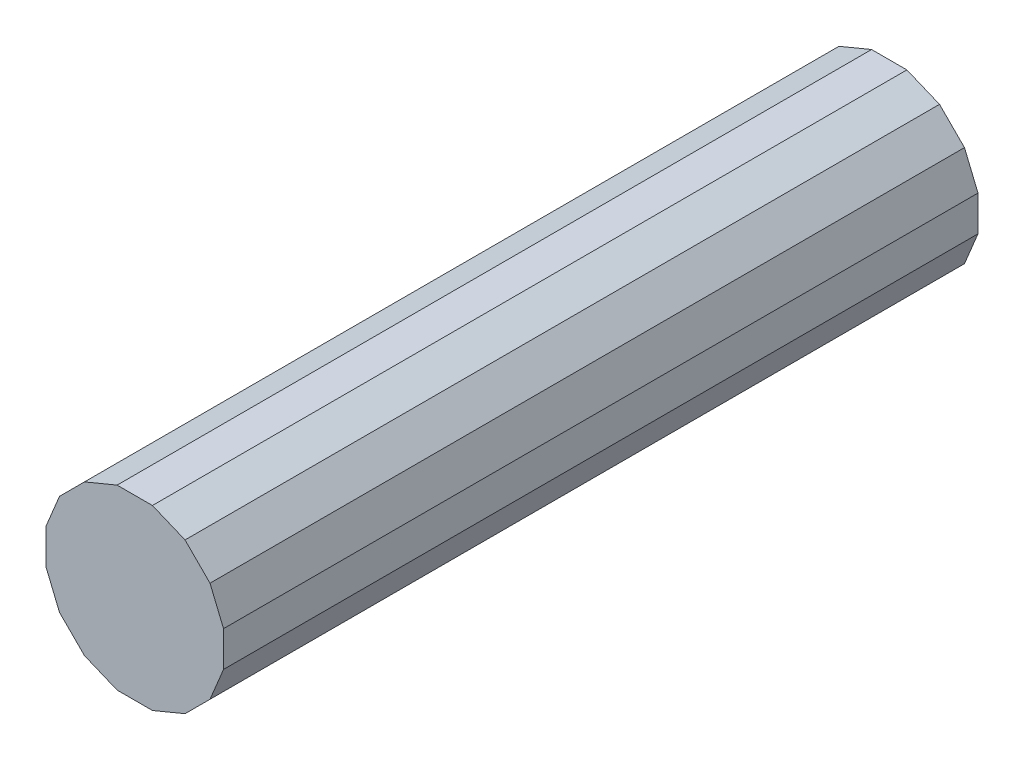
ISO-10303-21;
HEADER;
FILE_DESCRIPTION(('STEP AP214'),'2;1');
FILE_NAME('part.step','',(''),(''),'','','');
FILE_SCHEMA(('AUTOMOTIVE_DESIGN { 1 0 10303 214 1 1 1 1 }'));
ENDSEC;
DATA;
#1=APPLICATION_CONTEXT('core data for automotive mechanical design processes');
#2=APPLICATION_PROTOCOL_DEFINITION('international standard','automotive_design',2000,#1);
#3=PRODUCT_CONTEXT('',#1,'mechanical');
#4=PRODUCT('Part','Part','',(#3));
#5=PRODUCT_RELATED_PRODUCT_CATEGORY('part','',(#4));
#6=PRODUCT_DEFINITION_FORMATION('','',#4);
#7=PRODUCT_DEFINITION_CONTEXT('part definition',#1,'design');
#8=PRODUCT_DEFINITION('design','',#6,#7);
#9=PRODUCT_DEFINITION_SHAPE('','',#8);
#10=(LENGTH_UNIT() NAMED_UNIT(*) SI_UNIT(.MILLI.,.METRE.));
#11=(NAMED_UNIT(*) PLANE_ANGLE_UNIT() SI_UNIT($,.RADIAN.));
#12=(NAMED_UNIT(*) SI_UNIT($,.STERADIAN.) SOLID_ANGLE_UNIT());
#13=UNCERTAINTY_MEASURE_WITH_UNIT(LENGTH_MEASURE(1.E-05),#10,'distance_accuracy_value','');
#14=(GEOMETRIC_REPRESENTATION_CONTEXT(3) GLOBAL_UNCERTAINTY_ASSIGNED_CONTEXT((#13)) GLOBAL_UNIT_ASSIGNED_CONTEXT((#10,
#11,#12)) REPRESENTATION_CONTEXT('',''));
#15=CARTESIAN_POINT('',(0.,0.,0.));
#16=DIRECTION('',(0.,0.,1.));
#17=DIRECTION('',(1.,0.,0.));
#18=AXIS2_PLACEMENT_3D('',#15,#16,#17);
#19=CARTESIAN_POINT('',(-0.0999998,0.,0.));
#20=DIRECTION('',(-1.,0.,0.));
#21=DIRECTION('',(0.,0.,1.));
#22=AXIS2_PLACEMENT_3D('',#19,#20,#21);
#23=PLANE('',#22);
#24=DIRECTION('',(0.,0.,1.));
#25=VECTOR('',#24,1.);
#26=CARTESIAN_POINT('',(-0.0999998,0.01989074,0.));
#27=LINE('',#26,#25);
#28=CARTESIAN_POINT('',(-0.0999998,0.01989074,0.));
#29=VERTEX_POINT('',#28);
#30=CARTESIAN_POINT('',(-0.0999998,0.01989074,0.85000084));
#31=VERTEX_POINT('',#30);
#32=EDGE_CURVE('E20',#29,#31,#27,.T.);
#33=ORIENTED_EDGE('',*,*,#32,.F.);
#34=DIRECTION('',(0.,1.,0.));
#35=VECTOR('',#34,1.);
#36=CARTESIAN_POINT('',(-0.0999998,-6.703367703092E-07,0.));
#37=LINE('',#36,#35);
#38=CARTESIAN_POINT('',(-0.0999998000000094,-0.0198932800000039,0.));
#39=VERTEX_POINT('',#38);
#40=EDGE_CURVE('E231',#39,#29,#37,.T.);
#41=ORIENTED_EDGE('',*,*,#40,.F.);
#42=DIRECTION('',(0.,0.,1.));
#43=VECTOR('',#42,1.);
#44=CARTESIAN_POINT('',(-0.0999998000000189,-0.0198932800000078,0.));
#45=LINE('',#44,#43);
#46=CARTESIAN_POINT('',(-0.0999998000000047,-0.019893280000002,0.85000084));
#47=VERTEX_POINT('',#46);
#48=EDGE_CURVE('E227',#47,#39,#45,.F.);
#49=ORIENTED_EDGE('',*,*,#48,.F.);
#50=DIRECTION('',(0.,1.,0.));
#51=VECTOR('',#50,1.);
#52=CARTESIAN_POINT('',(-0.0999998,-6.703367703092E-07,0.85000084));
#53=LINE('',#52,#51);
#54=EDGE_CURVE('E127',#47,#31,#53,.T.);
#55=ORIENTED_EDGE('',*,*,#54,.T.);
#56=EDGE_LOOP('',(#33,#41,#49,#55));
#57=FACE_BOUND('',#56,.T.);
#58=ADVANCED_FACE('F17',(#57),#23,.T.);
#59=CARTESIAN_POINT('',(-0.0999998,0.01989074,0.));
#60=DIRECTION('',(-0.923894661971306,0.382646904575127,0.));
#61=DIRECTION('',(-0.382646904575127,-0.923894661971306,0.));
#62=AXIS2_PLACEMENT_3D('',#59,#60,#61);
#63=PLANE('',#62);
#64=DIRECTION('',(0.,0.,1.));
#65=VECTOR('',#64,1.);
#66=CARTESIAN_POINT('',(-0.08477758,0.05664454,0.));
#67=LINE('',#66,#65);
#68=CARTESIAN_POINT('',(-0.0847775799999906,0.0566445399999961,0.));
#69=VERTEX_POINT('',#68);
#70=CARTESIAN_POINT('',(-0.0847775799999906,0.0566445399999961,0.85000084));
#71=VERTEX_POINT('',#70);
#72=EDGE_CURVE('E190',#69,#71,#67,.T.);
#73=ORIENTED_EDGE('',*,*,#72,.F.);
#74=DIRECTION('',(0.382646904574652,0.923894661971503,0.));
#75=VECTOR('',#74,1.);
#76=CARTESIAN_POINT('',(-0.0999998,0.01989074,0.));
#77=LINE('',#76,#75);
#78=EDGE_CURVE('E200',#29,#69,#77,.T.);
#79=ORIENTED_EDGE('',*,*,#78,.F.);
#80=ORIENTED_EDGE('',*,*,#32,.T.);
#81=DIRECTION('',(0.382646904574652,0.923894661971503,0.));
#82=VECTOR('',#81,1.);
#83=CARTESIAN_POINT('',(-0.0999998,0.01989074,0.85000084));
#84=LINE('',#83,#82);
#85=EDGE_CURVE('E159',#31,#71,#84,.T.);
#86=ORIENTED_EDGE('',*,*,#85,.T.);
#87=EDGE_LOOP('',(#73,#79,#80,#86));
#88=FACE_BOUND('',#87,.T.);
#89=ADVANCED_FACE('F198',(#88),#63,.T.);
#90=CARTESIAN_POINT('',(-0.08477758,0.05664454,0.));
#91=DIRECTION('',(-0.707106781186548,0.707106781186548,0.));
#92=DIRECTION('',(-0.707106781186548,-0.707106781186548,0.));
#93=AXIS2_PLACEMENT_3D('',#90,#91,#92);
#94=PLANE('',#93);
#95=DIRECTION('',(0.,0.,1.));
#96=VECTOR('',#95,1.);
#97=CARTESIAN_POINT('',(-0.05664708,0.08477504,0.));
#98=LINE('',#97,#96);
#99=CARTESIAN_POINT('',(-0.05664708,0.08477504,0.));
#100=VERTEX_POINT('',#99);
#101=CARTESIAN_POINT('',(-0.05664708,0.08477504,0.85000084));
#102=VERTEX_POINT('',#101);
#103=EDGE_CURVE('E188',#100,#102,#98,.T.);
#104=ORIENTED_EDGE('',*,*,#103,.F.);
#105=DIRECTION('',(0.707106781186548,0.707106781186548,0.));
#106=VECTOR('',#105,1.);
#107=CARTESIAN_POINT('',(-0.08477758,0.05664454,0.));
#108=LINE('',#107,#106);
#109=EDGE_CURVE('E234',#69,#100,#108,.T.);
#110=ORIENTED_EDGE('',*,*,#109,.F.);
#111=ORIENTED_EDGE('',*,*,#72,.T.);
#112=DIRECTION('',(0.707106781186548,0.707106781186548,0.));
#113=VECTOR('',#112,1.);
#114=CARTESIAN_POINT('',(-0.08477758,0.05664454,0.85000084));
#115=LINE('',#114,#113);
#116=EDGE_CURVE('E203',#71,#102,#115,.T.);
#117=ORIENTED_EDGE('',*,*,#116,.T.);
#118=EDGE_LOOP('',(#104,#110,#111,#117));
#119=FACE_BOUND('',#118,.T.);
#120=ADVANCED_FACE('F307',(#119),#94,.T.);
#121=CARTESIAN_POINT('',(-0.05664708,0.08477504,0.));
#122=DIRECTION('',(-0.38270140287109,0.923872088679217,0.));
#123=DIRECTION('',(-0.923872088679217,-0.38270140287109,0.));
#124=AXIS2_PLACEMENT_3D('',#121,#122,#123);
#125=PLANE('',#124);
#126=DIRECTION('',(0.,0.,1.));
#127=VECTOR('',#126,1.);
#128=CARTESIAN_POINT('',(-0.01989328,0.0999998,0.));
#129=LINE('',#128,#127);
#130=CARTESIAN_POINT('',(-0.0198932800000007,0.0999998000000017,0.));
#131=VERTEX_POINT('',#130);
#132=CARTESIAN_POINT('',(-0.0198932800000007,0.0999998000000017,0.85000084));
#133=VERTEX_POINT('',#132);
#134=EDGE_CURVE('E185',#131,#133,#129,.T.);
#135=ORIENTED_EDGE('',*,*,#134,.F.);
#136=DIRECTION('',(0.923872088679253,0.382701402871005,0.));
#137=VECTOR('',#136,1.);
#138=CARTESIAN_POINT('',(-0.05664708,0.08477504,0.));
#139=LINE('',#138,#137);
#140=EDGE_CURVE('E237',#100,#131,#139,.T.);
#141=ORIENTED_EDGE('',*,*,#140,.F.);
#142=ORIENTED_EDGE('',*,*,#103,.T.);
#143=DIRECTION('',(0.923872088679253,0.382701402871005,0.));
#144=VECTOR('',#143,1.);
#145=CARTESIAN_POINT('',(-0.05664708,0.08477504,0.85000084));
#146=LINE('',#145,#144);
#147=EDGE_CURVE('E204',#102,#133,#146,.T.);
#148=ORIENTED_EDGE('',*,*,#147,.T.);
#149=EDGE_LOOP('',(#135,#141,#142,#148));
#150=FACE_BOUND('',#149,.T.);
#151=ADVANCED_FACE('F306',(#150),#125,.T.);
#152=CARTESIAN_POINT('',(0.,0.0999998,0.));
#153=DIRECTION('',(0.,1.,0.));
#154=DIRECTION('',(0.,0.,1.));
#155=AXIS2_PLACEMENT_3D('',#152,#153,#154);
#156=PLANE('',#155);
#157=DIRECTION('',(0.,0.,1.));
#158=VECTOR('',#157,1.);
#159=CARTESIAN_POINT('',(0.01989074,0.0999998,0.));
#160=LINE('',#159,#158);
#161=CARTESIAN_POINT('',(0.01989074,0.0999998,0.));
#162=VERTEX_POINT('',#161);
#163=CARTESIAN_POINT('',(0.01989074,0.0999998,0.85000084));
#164=VERTEX_POINT('',#163);
#165=EDGE_CURVE('E182',#162,#164,#160,.T.);
#166=ORIENTED_EDGE('',*,*,#165,.F.);
#167=DIRECTION('',(-1.,0.,0.));
#168=VECTOR('',#167,1.);
#169=CARTESIAN_POINT('',(-6.703367716298E-07,0.0999998,0.));
#170=LINE('',#169,#168);
#171=EDGE_CURVE('E240',#131,#162,#170,.F.);
#172=ORIENTED_EDGE('',*,*,#171,.F.);
#173=ORIENTED_EDGE('',*,*,#134,.T.);
#174=DIRECTION('',(-1.,0.,0.));
#175=VECTOR('',#174,1.);
#176=CARTESIAN_POINT('',(-6.703367716298E-07,0.0999998,0.85000084));
#177=LINE('',#176,#175);
#178=EDGE_CURVE('E209',#133,#164,#177,.F.);
#179=ORIENTED_EDGE('',*,*,#178,.T.);
#180=EDGE_LOOP('',(#166,#172,#173,#179));
#181=FACE_BOUND('',#180,.T.);
#182=ADVANCED_FACE('F302',(#181),#156,.T.);
#183=CARTESIAN_POINT('',(0.01989074,0.0999998,0.));
#184=DIRECTION('',(0.38270140287109,0.923872088679217,0.));
#185=DIRECTION('',(-0.923872088679217,0.38270140287109,0.));
#186=AXIS2_PLACEMENT_3D('',#183,#184,#185);
#187=PLANE('',#186);
#188=DIRECTION('',(0.,0.,1.));
#189=VECTOR('',#188,1.);
#190=CARTESIAN_POINT('',(0.05664454,0.08477504,0.));
#191=LINE('',#190,#189);
#192=CARTESIAN_POINT('',(0.0566445399999993,0.0847750399999983,0.));
#193=VERTEX_POINT('',#192);
#194=CARTESIAN_POINT('',(0.0566445399999993,0.0847750399999983,0.85000084));
#195=VERTEX_POINT('',#194);
#196=EDGE_CURVE('E179',#193,#195,#191,.T.);
#197=ORIENTED_EDGE('',*,*,#196,.F.);
#198=DIRECTION('',(0.923872088679253,-0.382701402871005,0.));
#199=VECTOR('',#198,1.);
#200=CARTESIAN_POINT('',(0.01989074,0.0999998,0.));
#201=LINE('',#200,#199);
#202=EDGE_CURVE('E243',#162,#193,#201,.T.);
#203=ORIENTED_EDGE('',*,*,#202,.F.);
#204=ORIENTED_EDGE('',*,*,#165,.T.);
#205=DIRECTION('',(0.923872088679253,-0.382701402871005,0.));
#206=VECTOR('',#205,1.);
#207=CARTESIAN_POINT('',(0.01989074,0.0999998,0.85000084));
#208=LINE('',#207,#206);
#209=EDGE_CURVE('E211',#164,#195,#208,.T.);
#210=ORIENTED_EDGE('',*,*,#209,.T.);
#211=EDGE_LOOP('',(#197,#203,#204,#210));
#212=FACE_BOUND('',#211,.T.);
#213=ADVANCED_FACE('F299',(#212),#187,.T.);
#214=CARTESIAN_POINT('',(0.05664454,0.08477504,0.));
#215=DIRECTION('',(0.707106781186548,0.707106781186548,0.));
#216=DIRECTION('',(-0.707106781186548,0.707106781186548,0.));
#217=AXIS2_PLACEMENT_3D('',#214,#215,#216);
#218=PLANE('',#217);
#219=DIRECTION('',(0.,0.,1.));
#220=VECTOR('',#219,1.);
#221=CARTESIAN_POINT('',(0.08477504,0.05664454,0.));
#222=LINE('',#221,#220);
#223=CARTESIAN_POINT('',(0.08477504,0.05664454,0.));
#224=VERTEX_POINT('',#223);
#225=CARTESIAN_POINT('',(0.08477504,0.05664454,0.85000084));
#226=VERTEX_POINT('',#225);
#227=EDGE_CURVE('E176',#224,#226,#222,.T.);
#228=ORIENTED_EDGE('',*,*,#227,.F.);
#229=DIRECTION('',(0.707106781186548,-0.707106781186548,0.));
#230=VECTOR('',#229,1.);
#231=CARTESIAN_POINT('',(0.05664454,0.08477504,0.));
#232=LINE('',#231,#230);
#233=EDGE_CURVE('E246',#193,#224,#232,.T.);
#234=ORIENTED_EDGE('',*,*,#233,.F.);
#235=ORIENTED_EDGE('',*,*,#196,.T.);
#236=DIRECTION('',(0.707106781186548,-0.707106781186548,0.));
#237=VECTOR('',#236,1.);
#238=CARTESIAN_POINT('',(0.05664454,0.08477504,0.85000084));
#239=LINE('',#238,#237);
#240=EDGE_CURVE('E213',#195,#226,#239,.T.);
#241=ORIENTED_EDGE('',*,*,#240,.T.);
#242=EDGE_LOOP('',(#228,#234,#235,#241));
#243=FACE_BOUND('',#242,.T.);
#244=ADVANCED_FACE('F296',(#243),#218,.T.);
#245=CARTESIAN_POINT('',(0.08477504,0.05664454,0.));
#246=DIRECTION('',(0.923872088679217,0.38270140287109,0.));
#247=DIRECTION('',(-0.38270140287109,0.923872088679217,0.));
#248=AXIS2_PLACEMENT_3D('',#245,#246,#247);
#249=PLANE('',#248);
#250=DIRECTION('',(0.,0.,-1.));
#251=VECTOR('',#250,1.);
#252=CARTESIAN_POINT('',(0.0999998,0.01989074,0.));
#253=LINE('',#252,#251);
#254=CARTESIAN_POINT('',(0.0999998000000017,0.0198907400000007,0.));
#255=VERTEX_POINT('',#254);
#256=CARTESIAN_POINT('',(0.0999998000000017,0.0198907400000007,0.85000084));
#257=VERTEX_POINT('',#256);
#258=EDGE_CURVE('E173',#255,#257,#253,.F.);
#259=ORIENTED_EDGE('',*,*,#258,.F.);
#260=DIRECTION('',(0.382701402871005,-0.923872088679253,0.));
#261=VECTOR('',#260,1.);
#262=CARTESIAN_POINT('',(0.08477504,0.05664454,0.));
#263=LINE('',#262,#261);
#264=EDGE_CURVE('E249',#224,#255,#263,.T.);
#265=ORIENTED_EDGE('',*,*,#264,.F.);
#266=ORIENTED_EDGE('',*,*,#227,.T.);
#267=DIRECTION('',(0.382701402871005,-0.923872088679253,0.));
#268=VECTOR('',#267,1.);
#269=CARTESIAN_POINT('',(0.08477504,0.05664454,0.85000084));
#270=LINE('',#269,#268);
#271=EDGE_CURVE('E215',#226,#257,#270,.T.);
#272=ORIENTED_EDGE('',*,*,#271,.T.);
#273=EDGE_LOOP('',(#259,#265,#266,#272));
#274=FACE_BOUND('',#273,.T.);
#275=ADVANCED_FACE('F292',(#274),#249,.T.);
#276=CARTESIAN_POINT('',(0.0999998,0.,0.));
#277=DIRECTION('',(1.,0.,0.));
#278=DIRECTION('',(0.,0.,-1.));
#279=AXIS2_PLACEMENT_3D('',#276,#277,#278);
#280=PLANE('',#279);
#281=DIRECTION('',(0.,0.,1.));
#282=VECTOR('',#281,1.);
#283=CARTESIAN_POINT('',(0.0999998,-0.01989328,0.));
#284=LINE('',#283,#282);
#285=CARTESIAN_POINT('',(0.0999998,-0.01989328,0.));
#286=VERTEX_POINT('',#285);
#287=CARTESIAN_POINT('',(0.0999998,-0.01989328,0.85000084));
#288=VERTEX_POINT('',#287);
#289=EDGE_CURVE('E170',#286,#288,#284,.T.);
#290=ORIENTED_EDGE('',*,*,#289,.F.);
#291=DIRECTION('',(0.,1.,0.));
#292=VECTOR('',#291,1.);
#293=CARTESIAN_POINT('',(0.0999998,-6.703367703092E-07,0.));
#294=LINE('',#293,#292);
#295=EDGE_CURVE('E252',#255,#286,#294,.F.);
#296=ORIENTED_EDGE('',*,*,#295,.F.);
#297=ORIENTED_EDGE('',*,*,#258,.T.);
#298=DIRECTION('',(0.,1.,0.));
#299=VECTOR('',#298,1.);
#300=CARTESIAN_POINT('',(0.0999998,-6.703367703092E-07,0.85000084));
#301=LINE('',#300,#299);
#302=EDGE_CURVE('E218',#257,#288,#301,.F.);
#303=ORIENTED_EDGE('',*,*,#302,.T.);
#304=EDGE_LOOP('',(#290,#296,#297,#303));
#305=FACE_BOUND('',#304,.T.);
#306=ADVANCED_FACE('F287',(#305),#280,.T.);
#307=CARTESIAN_POINT('',(0.0999998,-0.01989328,0.));
#308=DIRECTION('',(0.923872088679217,-0.38270140287109,0.));
#309=DIRECTION('',(0.38270140287109,0.923872088679217,0.));
#310=AXIS2_PLACEMENT_3D('',#307,#308,#309);
#311=PLANE('',#310);
#312=DIRECTION('',(0.,0.,1.));
#313=VECTOR('',#312,1.);
#314=CARTESIAN_POINT('',(0.08477504,-0.05664708,0.));
#315=LINE('',#314,#313);
#316=CARTESIAN_POINT('',(0.0847750399999983,-0.0566470799999993,0.));
#317=VERTEX_POINT('',#316);
#318=CARTESIAN_POINT('',(0.0847750399999983,-0.0566470799999993,0.85000084));
#319=VERTEX_POINT('',#318);
#320=EDGE_CURVE('E167',#317,#319,#315,.T.);
#321=ORIENTED_EDGE('',*,*,#320,.F.);
#322=DIRECTION('',(-0.382701402871005,-0.923872088679253,0.));
#323=VECTOR('',#322,1.);
#324=CARTESIAN_POINT('',(0.0999998,-0.01989328,0.));
#325=LINE('',#324,#323);
#326=EDGE_CURVE('E255',#286,#317,#325,.T.);
#327=ORIENTED_EDGE('',*,*,#326,.F.);
#328=ORIENTED_EDGE('',*,*,#289,.T.);
#329=DIRECTION('',(-0.382701402871005,-0.923872088679253,0.));
#330=VECTOR('',#329,1.);
#331=CARTESIAN_POINT('',(0.0999998,-0.01989328,0.85000084));
#332=LINE('',#331,#330);
#333=EDGE_CURVE('E220',#288,#319,#332,.T.);
#334=ORIENTED_EDGE('',*,*,#333,.T.);
#335=EDGE_LOOP('',(#321,#327,#328,#334));
#336=FACE_BOUND('',#335,.T.);
#337=ADVANCED_FACE('F285',(#336),#311,.T.);
#338=CARTESIAN_POINT('',(0.08477504,-0.05664708,0.));
#339=DIRECTION('',(0.707106781186548,-0.707106781186548,0.));
#340=DIRECTION('',(0.707106781186548,0.707106781186548,0.));
#341=AXIS2_PLACEMENT_3D('',#338,#339,#340);
#342=PLANE('',#341);
#343=DIRECTION('',(0.,0.,1.));
#344=VECTOR('',#343,1.);
#345=CARTESIAN_POINT('',(0.05664454,-0.08477758,0.));
#346=LINE('',#345,#344);
#347=CARTESIAN_POINT('',(0.05664454,-0.08477758,0.));
#348=VERTEX_POINT('',#347);
#349=CARTESIAN_POINT('',(0.05664454,-0.08477758,0.85000084));
#350=VERTEX_POINT('',#349);
#351=EDGE_CURVE('E164',#348,#350,#346,.T.);
#352=ORIENTED_EDGE('',*,*,#351,.F.);
#353=DIRECTION('',(-0.707106781186548,-0.707106781186548,0.));
#354=VECTOR('',#353,1.);
#355=CARTESIAN_POINT('',(0.08477504,-0.05664708,0.));
#356=LINE('',#355,#354);
#357=EDGE_CURVE('E258',#317,#348,#356,.T.);
#358=ORIENTED_EDGE('',*,*,#357,.F.);
#359=ORIENTED_EDGE('',*,*,#320,.T.);
#360=DIRECTION('',(-0.707106781186548,-0.707106781186548,0.));
#361=VECTOR('',#360,1.);
#362=CARTESIAN_POINT('',(0.08477504,-0.05664708,0.85000084));
#363=LINE('',#362,#361);
#364=EDGE_CURVE('E222',#319,#350,#363,.T.);
#365=ORIENTED_EDGE('',*,*,#364,.T.);
#366=EDGE_LOOP('',(#352,#358,#359,#365));
#367=FACE_BOUND('',#366,.T.);
#368=ADVANCED_FACE('F282',(#367),#342,.T.);
#369=CARTESIAN_POINT('',(0.05664454,-0.08477758,0.));
#370=DIRECTION('',(0.382646904575127,-0.923894661971306,0.));
#371=DIRECTION('',(0.923894661971306,0.382646904575127,0.));
#372=AXIS2_PLACEMENT_3D('',#369,#370,#371);
#373=PLANE('',#372);
#374=DIRECTION('',(0.,0.,-1.));
#375=VECTOR('',#374,1.);
#376=CARTESIAN_POINT('',(0.01989074,-0.0999998,0.));
#377=LINE('',#376,#375);
#378=CARTESIAN_POINT('',(0.0198907400000039,-0.0999998000000094,0.));
#379=VERTEX_POINT('',#378);
#380=CARTESIAN_POINT('',(0.0198907400000039,-0.0999998000000094,0.85000084));
#381=VERTEX_POINT('',#380);
#382=EDGE_CURVE('E140',#379,#381,#377,.F.);
#383=ORIENTED_EDGE('',*,*,#382,.F.);
#384=DIRECTION('',(-0.923894661971503,-0.382646904574652,0.));
#385=VECTOR('',#384,1.);
#386=CARTESIAN_POINT('',(0.05664454,-0.08477758,0.));
#387=LINE('',#386,#385);
#388=EDGE_CURVE('E261',#348,#379,#387,.T.);
#389=ORIENTED_EDGE('',*,*,#388,.F.);
#390=ORIENTED_EDGE('',*,*,#351,.T.);
#391=DIRECTION('',(-0.923894661971503,-0.382646904574652,0.));
#392=VECTOR('',#391,1.);
#393=CARTESIAN_POINT('',(0.05664454,-0.08477758,0.85000084));
#394=LINE('',#393,#392);
#395=EDGE_CURVE('E145',#350,#381,#394,.T.);
#396=ORIENTED_EDGE('',*,*,#395,.T.);
#397=EDGE_LOOP('',(#383,#389,#390,#396));
#398=FACE_BOUND('',#397,.T.);
#399=ADVANCED_FACE('F278',(#398),#373,.T.);
#400=CARTESIAN_POINT('',(0.01989074,-0.0999998,0.));
#401=DIRECTION('',(0.,-1.,0.));
#402=DIRECTION('',(0.,0.,-1.));
#403=AXIS2_PLACEMENT_3D('',#400,#401,#402);
#404=PLANE('',#403);
#405=DIRECTION('',(-1.,0.,0.));
#406=VECTOR('',#405,1.);
#407=CARTESIAN_POINT('',(-6.703367716298E-07,-0.0999998,0.85000084));
#408=LINE('',#407,#406);
#409=CARTESIAN_POINT('',(-0.01989328,-0.0999998,0.85000084));
#410=VERTEX_POINT('',#409);
#411=EDGE_CURVE('E134',#381,#410,#408,.T.);
#412=ORIENTED_EDGE('',*,*,#411,.T.);
#413=DIRECTION('',(0.,0.,1.));
#414=VECTOR('',#413,1.);
#415=CARTESIAN_POINT('',(-0.01989328,-0.0999998,0.));
#416=LINE('',#415,#414);
#417=CARTESIAN_POINT('',(-0.01989328,-0.0999998,0.));
#418=VERTEX_POINT('',#417);
#419=EDGE_CURVE('E138',#418,#410,#416,.T.);
#420=ORIENTED_EDGE('',*,*,#419,.F.);
#421=DIRECTION('',(-1.,0.,0.));
#422=VECTOR('',#421,1.);
#423=CARTESIAN_POINT('',(-6.703367716298E-07,-0.0999998,0.));
#424=LINE('',#423,#422);
#425=EDGE_CURVE('E264',#379,#418,#424,.T.);
#426=ORIENTED_EDGE('',*,*,#425,.F.);
#427=ORIENTED_EDGE('',*,*,#382,.T.);
#428=EDGE_LOOP('',(#412,#420,#426,#427));
#429=FACE_BOUND('',#428,.T.);
#430=ADVANCED_FACE('F136',(#429),#404,.T.);
#431=CARTESIAN_POINT('',(-0.01989328,-0.0999998,0.));
#432=DIRECTION('',(-0.382646904575127,-0.923894661971306,0.));
#433=DIRECTION('',(0.923894661971306,-0.382646904575127,0.));
#434=AXIS2_PLACEMENT_3D('',#431,#432,#433);
#435=PLANE('',#434);
#436=DIRECTION('',(0.,0.,1.));
#437=VECTOR('',#436,1.);
#438=CARTESIAN_POINT('',(-0.05664708,-0.08477758,0.));
#439=LINE('',#438,#437);
#440=CARTESIAN_POINT('',(-0.0566470799999961,-0.0847775799999906,0.));
#441=VERTEX_POINT('',#440);
#442=CARTESIAN_POINT('',(-0.0566470799999961,-0.0847775799999906,0.85000084));
#443=VERTEX_POINT('',#442);
#444=EDGE_CURVE('E266',#441,#443,#439,.T.);
#445=ORIENTED_EDGE('',*,*,#444,.F.);
#446=DIRECTION('',(-0.923894661971503,0.382646904574652,0.));
#447=VECTOR('',#446,1.);
#448=CARTESIAN_POINT('',(-0.01989328,-0.0999998,0.));
#449=LINE('',#448,#447);
#450=EDGE_CURVE('E152',#418,#441,#449,.T.);
#451=ORIENTED_EDGE('',*,*,#450,.F.);
#452=ORIENTED_EDGE('',*,*,#419,.T.);
#453=DIRECTION('',(-0.923894661971503,0.382646904574652,0.));
#454=VECTOR('',#453,1.);
#455=CARTESIAN_POINT('',(-0.01989328,-0.0999998,0.85000084));
#456=LINE('',#455,#454);
#457=EDGE_CURVE('E149',#410,#443,#456,.T.);
#458=ORIENTED_EDGE('',*,*,#457,.T.);
#459=EDGE_LOOP('',(#445,#451,#452,#458));
#460=FACE_BOUND('',#459,.T.);
#461=ADVANCED_FACE('F148',(#460),#435,.T.);
#462=CARTESIAN_POINT('',(-6.703367716298E-07,-6.703367703092E-07,0.85000084));
#463=DIRECTION('',(0.,0.,-1.));
#464=DIRECTION('',(-1.,0.,0.));
#465=AXIS2_PLACEMENT_3D('',#462,#463,#464);
#466=PLANE('',#465);
#467=ORIENTED_EDGE('',*,*,#395,.F.);
#468=ORIENTED_EDGE('',*,*,#364,.F.);
#469=ORIENTED_EDGE('',*,*,#333,.F.);
#470=ORIENTED_EDGE('',*,*,#302,.F.);
#471=ORIENTED_EDGE('',*,*,#271,.F.);
#472=ORIENTED_EDGE('',*,*,#240,.F.);
#473=ORIENTED_EDGE('',*,*,#209,.F.);
#474=ORIENTED_EDGE('',*,*,#178,.F.);
#475=ORIENTED_EDGE('',*,*,#147,.F.);
#476=ORIENTED_EDGE('',*,*,#116,.F.);
#477=ORIENTED_EDGE('',*,*,#85,.F.);
#478=ORIENTED_EDGE('',*,*,#54,.F.);
#479=DIRECTION('',(0.382646904575127,-0.923894661971306,0.));
#480=VECTOR('',#479,1.);
#481=CARTESIAN_POINT('',(-0.08477758,-0.05664708,0.85000084));
#482=LINE('',#481,#480);
#483=CARTESIAN_POINT('',(-0.08477758,-0.05664708,0.85000084));
#484=VERTEX_POINT('',#483);
#485=EDGE_CURVE('E144',#484,#47,#482,.F.);
#486=ORIENTED_EDGE('',*,*,#485,.F.);
#487=DIRECTION('',(0.707106781186548,-0.707106781186548,0.));
#488=VECTOR('',#487,1.);
#489=CARTESIAN_POINT('',(-0.05664708,-0.08477758,0.85000084));
#490=LINE('',#489,#488);
#491=EDGE_CURVE('E156',#443,#484,#490,.F.);
#492=ORIENTED_EDGE('',*,*,#491,.F.);
#493=ORIENTED_EDGE('',*,*,#457,.F.);
#494=ORIENTED_EDGE('',*,*,#411,.F.);
#495=EDGE_LOOP('',(#467,#468,#469,#470,#471,#472,#473,#474,#475,#476,#477,#478,#486,#492,#493,#494));
#496=FACE_BOUND('',#495,.T.);
#497=ADVANCED_FACE('F154',(#496),#466,.F.);
#498=CARTESIAN_POINT('',(-0.08477758,-0.05664708,0.));
#499=DIRECTION('',(-0.923894661971306,-0.382646904575127,0.));
#500=DIRECTION('',(0.382646904575127,-0.923894661971306,0.));
#501=AXIS2_PLACEMENT_3D('',#498,#499,#500);
#502=PLANE('',#501);
#503=ORIENTED_EDGE('',*,*,#48,.T.);
#504=DIRECTION('',(-0.382646904574652,0.923894661971503,0.));
#505=VECTOR('',#504,1.);
#506=CARTESIAN_POINT('',(-0.08477758,-0.05664708,0.));
#507=LINE('',#506,#505);
#508=CARTESIAN_POINT('',(-0.08477758,-0.05664708,0.));
#509=VERTEX_POINT('',#508);
#510=EDGE_CURVE('E35',#509,#39,#507,.T.);
#511=ORIENTED_EDGE('',*,*,#510,.F.);
#512=DIRECTION('',(0.,0.,1.));
#513=VECTOR('',#512,1.);
#514=CARTESIAN_POINT('',(-0.08477758,-0.05664708,0.));
#515=LINE('',#514,#513);
#516=EDGE_CURVE('E26',#484,#509,#515,.F.);
#517=ORIENTED_EDGE('',*,*,#516,.F.);
#518=ORIENTED_EDGE('',*,*,#485,.T.);
#519=EDGE_LOOP('',(#503,#511,#517,#518));
#520=FACE_BOUND('',#519,.T.);
#521=ADVANCED_FACE('F272',(#520),#502,.T.);
#522=CARTESIAN_POINT('',(-6.703367716298E-07,-6.703367703092E-07,0.));
#523=DIRECTION('',(0.,0.,-1.));
#524=DIRECTION('',(-1.,0.,0.));
#525=AXIS2_PLACEMENT_3D('',#522,#523,#524);
#526=PLANE('',#525);
#527=ORIENTED_EDGE('',*,*,#388,.T.);
#528=ORIENTED_EDGE('',*,*,#425,.T.);
#529=ORIENTED_EDGE('',*,*,#450,.T.);
#530=DIRECTION('',(0.707106781186548,-0.707106781186548,0.));
#531=VECTOR('',#530,1.);
#532=CARTESIAN_POINT('',(-0.05664708,-0.08477758,0.));
#533=LINE('',#532,#531);
#534=EDGE_CURVE('E11',#509,#441,#533,.T.);
#535=ORIENTED_EDGE('',*,*,#534,.F.);
#536=ORIENTED_EDGE('',*,*,#510,.T.);
#537=ORIENTED_EDGE('',*,*,#40,.T.);
#538=ORIENTED_EDGE('',*,*,#78,.T.);
#539=ORIENTED_EDGE('',*,*,#109,.T.);
#540=ORIENTED_EDGE('',*,*,#140,.T.);
#541=ORIENTED_EDGE('',*,*,#171,.T.);
#542=ORIENTED_EDGE('',*,*,#202,.T.);
#543=ORIENTED_EDGE('',*,*,#233,.T.);
#544=ORIENTED_EDGE('',*,*,#264,.T.);
#545=ORIENTED_EDGE('',*,*,#295,.T.);
#546=ORIENTED_EDGE('',*,*,#326,.T.);
#547=ORIENTED_EDGE('',*,*,#357,.T.);
#548=EDGE_LOOP('',(#527,#528,#529,#535,#536,#537,#538,#539,#540,#541,#542,#543,#544,#545,#546,#547));
#549=FACE_BOUND('',#548,.T.);
#550=ADVANCED_FACE('F274',(#549),#526,.T.);
#551=CARTESIAN_POINT('',(-0.05664708,-0.08477758,0.));
#552=DIRECTION('',(-0.707106781186548,-0.707106781186548,0.));
#553=DIRECTION('',(0.707106781186548,-0.707106781186548,0.));
#554=AXIS2_PLACEMENT_3D('',#551,#552,#553);
#555=PLANE('',#554);
#556=ORIENTED_EDGE('',*,*,#516,.T.);
#557=ORIENTED_EDGE('',*,*,#534,.T.);
#558=ORIENTED_EDGE('',*,*,#444,.T.);
#559=ORIENTED_EDGE('',*,*,#491,.T.);
#560=EDGE_LOOP('',(#556,#557,#558,#559));
#561=FACE_BOUND('',#560,.T.);
#562=ADVANCED_FACE('F271',(#561),#555,.T.);
#563=CLOSED_SHELL('',(#58,#89,#120,#151,#182,#213,#244,#275,#306,#337,#368,#399,#430,#461,#497,
#521,#550,#562));
#564=MANIFOLD_SOLID_BREP('B1',#563);
#565=ADVANCED_BREP_SHAPE_REPRESENTATION('',(#18,#564),#14);
#566=SHAPE_DEFINITION_REPRESENTATION(#9,#565);
ENDSEC;
END-ISO-10303-21;
